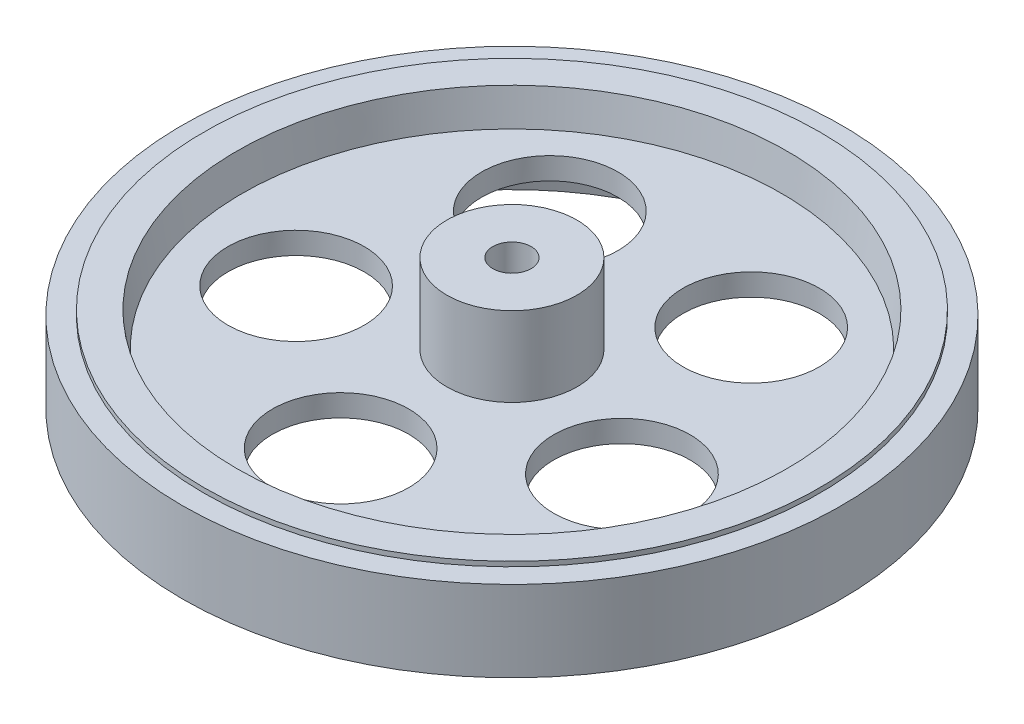
ISO-10303-21;
HEADER;
FILE_DESCRIPTION(('STEP AP214'),'2;1');
FILE_NAME('part.step','',(''),(''),'','','');
FILE_SCHEMA(('AUTOMOTIVE_DESIGN { 1 0 10303 214 1 1 1 1 }'));
ENDSEC;
DATA;
#1=APPLICATION_CONTEXT('core data for automotive mechanical design processes');
#2=APPLICATION_PROTOCOL_DEFINITION('international standard','automotive_design',2000,#1);
#3=PRODUCT_CONTEXT('',#1,'mechanical');
#4=PRODUCT('Part','Part','',(#3));
#5=PRODUCT_RELATED_PRODUCT_CATEGORY('part','',(#4));
#6=PRODUCT_DEFINITION_FORMATION('','',#4);
#7=PRODUCT_DEFINITION_CONTEXT('part definition',#1,'design');
#8=PRODUCT_DEFINITION('design','',#6,#7);
#9=PRODUCT_DEFINITION_SHAPE('','',#8);
#10=(LENGTH_UNIT() NAMED_UNIT(*) SI_UNIT(.MILLI.,.METRE.));
#11=(NAMED_UNIT(*) PLANE_ANGLE_UNIT() SI_UNIT($,.RADIAN.));
#12=(NAMED_UNIT(*) SI_UNIT($,.STERADIAN.) SOLID_ANGLE_UNIT());
#13=UNCERTAINTY_MEASURE_WITH_UNIT(LENGTH_MEASURE(1.E-05),#10,'distance_accuracy_value','');
#14=(GEOMETRIC_REPRESENTATION_CONTEXT(3) GLOBAL_UNCERTAINTY_ASSIGNED_CONTEXT((#13)) GLOBAL_UNIT_ASSIGNED_CONTEXT((#10,
#11,#12)) REPRESENTATION_CONTEXT('',''));
#15=CARTESIAN_POINT('',(0.,0.,0.));
#16=DIRECTION('',(0.,0.,1.));
#17=DIRECTION('',(1.,0.,0.));
#18=AXIS2_PLACEMENT_3D('',#15,#16,#17);
#19=CARTESIAN_POINT('',(0.,-1.6,0.));
#20=DIRECTION('',(0.,-1.,0.));
#21=DIRECTION('',(0.,0.,1.));
#22=AXIS2_PLACEMENT_3D('',#19,#20,#21);
#23=PLANE('',#22);
#24=CARTESIAN_POINT('',(0.,-1.6,0.));
#25=DIRECTION('',(0.,-1.,0.));
#26=DIRECTION('',(0.,0.,-1.));
#27=AXIS2_PLACEMENT_3D('',#24,#25,#26);
#28=CIRCLE('',#27,39.4);
#29=CARTESIAN_POINT('',(0.,-1.6,-39.4));
#30=VERTEX_POINT('',#29);
#31=EDGE_CURVE('E64',#30,#30,#28,.T.);
#32=ORIENTED_EDGE('',*,*,#31,.T.);
#33=EDGE_LOOP('',(#32));
#34=FACE_BOUND('',#33,.T.);
#35=CARTESIAN_POINT('',(0.,-1.6,25.));
#36=DIRECTION('',(0.,-1.,0.));
#37=DIRECTION('',(0.,0.,-1.));
#38=AXIS2_PLACEMENT_3D('',#35,#36,#37);
#39=CIRCLE('',#38,9.95);
#40=CARTESIAN_POINT('',(0.,-1.6,15.05));
#41=VERTEX_POINT('',#40);
#42=EDGE_CURVE('E61',#41,#41,#39,.T.);
#43=ORIENTED_EDGE('',*,*,#42,.F.);
#44=EDGE_LOOP('',(#43));
#45=FACE_BOUND('',#44,.T.);
#46=CARTESIAN_POINT('',(23.7764129073788,-1.6,7.72542485937369));
#47=DIRECTION('',(0.,-1.,0.));
#48=DIRECTION('',(0.,0.,-1.));
#49=AXIS2_PLACEMENT_3D('',#46,#47,#48);
#50=CIRCLE('',#49,9.95);
#51=CARTESIAN_POINT('',(23.7764129073788,-1.6,-2.22457514062631));
#52=VERTEX_POINT('',#51);
#53=EDGE_CURVE('E66',#52,#52,#50,.T.);
#54=ORIENTED_EDGE('',*,*,#53,.F.);
#55=EDGE_LOOP('',(#54));
#56=FACE_BOUND('',#55,.T.);
#57=CARTESIAN_POINT('',(14.6946313073118,-1.6,-20.2254248593737));
#58=DIRECTION('',(0.,-1.,0.));
#59=DIRECTION('',(0.,0.,-1.));
#60=AXIS2_PLACEMENT_3D('',#57,#58,#59);
#61=CIRCLE('',#60,9.95);
#62=CARTESIAN_POINT('',(14.6946313073118,-1.6,-30.1754248593737));
#63=VERTEX_POINT('',#62);
#64=EDGE_CURVE('E69',#63,#63,#61,.T.);
#65=ORIENTED_EDGE('',*,*,#64,.F.);
#66=EDGE_LOOP('',(#65));
#67=FACE_BOUND('',#66,.T.);
#68=CARTESIAN_POINT('',(-14.6946313073118,-1.6,-20.2254248593737));
#69=DIRECTION('',(0.,-1.,0.));
#70=DIRECTION('',(0.,0.,-1.));
#71=AXIS2_PLACEMENT_3D('',#68,#69,#70);
#72=CIRCLE('',#71,9.95);
#73=CARTESIAN_POINT('',(-14.6946313073118,-1.6,-30.1754248593737));
#74=VERTEX_POINT('',#73);
#75=EDGE_CURVE('E72',#74,#74,#72,.T.);
#76=ORIENTED_EDGE('',*,*,#75,.F.);
#77=EDGE_LOOP('',(#76));
#78=FACE_BOUND('',#77,.T.);
#79=CARTESIAN_POINT('',(-23.7764129073788,-1.6,7.72542485937369));
#80=DIRECTION('',(0.,-1.,0.));
#81=DIRECTION('',(0.,0.,-1.));
#82=AXIS2_PLACEMENT_3D('',#79,#80,#81);
#83=CIRCLE('',#82,9.95);
#84=CARTESIAN_POINT('',(-23.7764129073788,-1.6,-2.22457514062631));
#85=VERTEX_POINT('',#84);
#86=EDGE_CURVE('E46',#85,#85,#83,.T.);
#87=ORIENTED_EDGE('',*,*,#86,.F.);
#88=EDGE_LOOP('',(#87));
#89=FACE_BOUND('',#88,.T.);
#90=CARTESIAN_POINT('',(0.,-1.6,0.));
#91=DIRECTION('',(0.,-1.,0.));
#92=DIRECTION('',(0.,0.,-1.));
#93=AXIS2_PLACEMENT_3D('',#90,#91,#92);
#94=CIRCLE('',#93,8.5);
#95=CARTESIAN_POINT('',(0.,-1.6,-8.5));
#96=VERTEX_POINT('',#95);
#97=EDGE_CURVE('E223',#96,#96,#94,.T.);
#98=ORIENTED_EDGE('',*,*,#97,.F.);
#99=EDGE_LOOP('',(#98));
#100=FACE_BOUND('',#99,.T.);
#101=ADVANCED_FACE('F42',(#34,#45,#56,#67,#78,#89,#100),#23,.T.);
#102=CARTESIAN_POINT('',(0.,5.9,0.));
#103=DIRECTION('',(0.,-1.,0.));
#104=DIRECTION('',(0.,0.,-1.));
#105=AXIS2_PLACEMENT_3D('',#102,#103,#104);
#106=CYLINDRICAL_SURFACE('',#105,48.1);
#107=CARTESIAN_POINT('',(0.,5.9,0.));
#108=DIRECTION('',(0.,1.,0.));
#109=DIRECTION('',(0.,0.,1.));
#110=AXIS2_PLACEMENT_3D('',#107,#108,#109);
#111=CIRCLE('',#110,48.1);
#112=CARTESIAN_POINT('',(0.,5.9,48.1));
#113=VERTEX_POINT('',#112);
#114=EDGE_CURVE('E50',#113,#113,#111,.T.);
#115=ORIENTED_EDGE('',*,*,#114,.F.);
#116=EDGE_LOOP('',(#115));
#117=FACE_BOUND('',#116,.T.);
#118=CARTESIAN_POINT('',(0.,-5.9,0.));
#119=DIRECTION('',(0.,1.,0.));
#120=DIRECTION('',(0.,0.,1.));
#121=AXIS2_PLACEMENT_3D('',#118,#119,#120);
#122=CIRCLE('',#121,48.1);
#123=CARTESIAN_POINT('',(0.,-5.9,48.1));
#124=VERTEX_POINT('',#123);
#125=EDGE_CURVE('E95',#124,#124,#122,.T.);
#126=ORIENTED_EDGE('',*,*,#125,.T.);
#127=EDGE_LOOP('',(#126));
#128=FACE_BOUND('',#127,.T.);
#129=ADVANCED_FACE('F44',(#117,#128),#106,.T.);
#130=CARTESIAN_POINT('',(0.,5.9,0.));
#131=DIRECTION('',(0.,1.,0.));
#132=DIRECTION('',(0.,0.,1.));
#133=AXIS2_PLACEMENT_3D('',#130,#131,#132);
#134=PLANE('',#133);
#135=CARTESIAN_POINT('',(0.,5.9,0.));
#136=DIRECTION('',(0.,1.,0.));
#137=DIRECTION('',(0.,0.,1.));
#138=AXIS2_PLACEMENT_3D('',#135,#136,#137);
#139=CIRCLE('',#138,44.95);
#140=CARTESIAN_POINT('',(0.,5.9,44.95));
#141=VERTEX_POINT('',#140);
#142=EDGE_CURVE('E104',#141,#141,#139,.T.);
#143=ORIENTED_EDGE('',*,*,#142,.F.);
#144=EDGE_LOOP('',(#143));
#145=FACE_BOUND('',#144,.T.);
#146=ORIENTED_EDGE('',*,*,#114,.T.);
#147=EDGE_LOOP('',(#146));
#148=FACE_BOUND('',#147,.T.);
#149=ADVANCED_FACE('F121',(#145,#148),#134,.T.);
#150=CARTESIAN_POINT('',(0.,6.6,0.));
#151=DIRECTION('',(0.,-1.,0.));
#152=DIRECTION('',(0.,0.,-1.));
#153=AXIS2_PLACEMENT_3D('',#150,#151,#152);
#154=CYLINDRICAL_SURFACE('',#153,44.95);
#155=CARTESIAN_POINT('',(0.,6.6,0.));
#156=DIRECTION('',(0.,1.,0.));
#157=DIRECTION('',(0.,0.,1.));
#158=AXIS2_PLACEMENT_3D('',#155,#156,#157);
#159=CIRCLE('',#158,44.95);
#160=CARTESIAN_POINT('',(0.,6.6,44.95));
#161=VERTEX_POINT('',#160);
#162=EDGE_CURVE('E55',#161,#161,#159,.T.);
#163=ORIENTED_EDGE('',*,*,#162,.F.);
#164=EDGE_LOOP('',(#163));
#165=FACE_BOUND('',#164,.T.);
#166=ORIENTED_EDGE('',*,*,#142,.T.);
#167=EDGE_LOOP('',(#166));
#168=FACE_BOUND('',#167,.T.);
#169=ADVANCED_FACE('F115',(#165,#168),#154,.T.);
#170=CARTESIAN_POINT('',(0.,6.6,0.));
#171=DIRECTION('',(0.,1.,0.));
#172=DIRECTION('',(0.,0.,1.));
#173=AXIS2_PLACEMENT_3D('',#170,#171,#172);
#174=PLANE('',#173);
#175=CARTESIAN_POINT('',(0.,6.6,0.));
#176=DIRECTION('',(0.,1.,0.));
#177=DIRECTION('',(0.,0.,1.));
#178=AXIS2_PLACEMENT_3D('',#175,#176,#177);
#179=CIRCLE('',#178,40.15);
#180=CARTESIAN_POINT('',(0.,6.6,40.15));
#181=VERTEX_POINT('',#180);
#182=EDGE_CURVE('E101',#181,#181,#179,.T.);
#183=ORIENTED_EDGE('',*,*,#182,.F.);
#184=EDGE_LOOP('',(#183));
#185=FACE_BOUND('',#184,.T.);
#186=ORIENTED_EDGE('',*,*,#162,.T.);
#187=EDGE_LOOP('',(#186));
#188=FACE_BOUND('',#187,.T.);
#189=ADVANCED_FACE('F112',(#185,#188),#174,.T.);
#190=CARTESIAN_POINT('',(0.,1.6,0.));
#191=DIRECTION('',(0.,1.,0.));
#192=DIRECTION('',(0.,0.,1.));
#193=AXIS2_PLACEMENT_3D('',#190,#191,#192);
#194=CONICAL_SURFACE('',#193,39.4,0.148889947609499);
#195=ORIENTED_EDGE('',*,*,#182,.T.);
#196=EDGE_LOOP('',(#195));
#197=FACE_BOUND('',#196,.T.);
#198=CARTESIAN_POINT('',(0.,1.6,0.));
#199=DIRECTION('',(0.,1.,0.));
#200=DIRECTION('',(0.,0.,1.));
#201=AXIS2_PLACEMENT_3D('',#198,#199,#200);
#202=CIRCLE('',#201,39.4);
#203=CARTESIAN_POINT('',(0.,1.6,39.4));
#204=VERTEX_POINT('',#203);
#205=EDGE_CURVE('E98',#204,#204,#202,.T.);
#206=ORIENTED_EDGE('',*,*,#205,.F.);
#207=EDGE_LOOP('',(#206));
#208=FACE_BOUND('',#207,.T.);
#209=ADVANCED_FACE('F109',(#197,#208),#194,.F.);
#210=CARTESIAN_POINT('',(0.,1.6,0.));
#211=DIRECTION('',(0.,1.,0.));
#212=DIRECTION('',(0.,0.,1.));
#213=AXIS2_PLACEMENT_3D('',#210,#211,#212);
#214=PLANE('',#213);
#215=CARTESIAN_POINT('',(0.,1.6,0.));
#216=DIRECTION('',(0.,1.,0.));
#217=DIRECTION('',(0.,0.,1.));
#218=AXIS2_PLACEMENT_3D('',#215,#216,#217);
#219=CIRCLE('',#218,9.5);
#220=CARTESIAN_POINT('',(0.,1.6,9.5));
#221=VERTEX_POINT('',#220);
#222=EDGE_CURVE('E222',#221,#221,#219,.T.);
#223=ORIENTED_EDGE('',*,*,#222,.F.);
#224=EDGE_LOOP('',(#223));
#225=FACE_BOUND('',#224,.T.);
#226=CARTESIAN_POINT('',(-23.7764129073788,1.6,7.72542485937369));
#227=DIRECTION('',(0.,1.,0.));
#228=DIRECTION('',(0.,0.,1.));
#229=AXIS2_PLACEMENT_3D('',#226,#227,#228);
#230=CIRCLE('',#229,9.95);
#231=CARTESIAN_POINT('',(-23.7764129073788,1.6,17.6754248593737));
#232=VERTEX_POINT('',#231);
#233=EDGE_CURVE('E70',#232,#232,#230,.T.);
#234=ORIENTED_EDGE('',*,*,#233,.F.);
#235=EDGE_LOOP('',(#234));
#236=FACE_BOUND('',#235,.T.);
#237=CARTESIAN_POINT('',(-14.6946313073118,1.6,-20.2254248593737));
#238=DIRECTION('',(0.,1.,0.));
#239=DIRECTION('',(0.,0.,1.));
#240=AXIS2_PLACEMENT_3D('',#237,#238,#239);
#241=CIRCLE('',#240,9.95);
#242=CARTESIAN_POINT('',(-14.6946313073118,1.6,-10.2754248593737));
#243=VERTEX_POINT('',#242);
#244=EDGE_CURVE('E233',#243,#243,#241,.T.);
#245=ORIENTED_EDGE('',*,*,#244,.F.);
#246=EDGE_LOOP('',(#245));
#247=FACE_BOUND('',#246,.T.);
#248=CARTESIAN_POINT('',(14.6946313073118,1.6,-20.2254248593737));
#249=DIRECTION('',(0.,1.,0.));
#250=DIRECTION('',(0.,0.,1.));
#251=AXIS2_PLACEMENT_3D('',#248,#249,#250);
#252=CIRCLE('',#251,9.95);
#253=CARTESIAN_POINT('',(14.6946313073118,1.6,-10.2754248593737));
#254=VERTEX_POINT('',#253);
#255=EDGE_CURVE('E235',#254,#254,#252,.T.);
#256=ORIENTED_EDGE('',*,*,#255,.F.);
#257=EDGE_LOOP('',(#256));
#258=FACE_BOUND('',#257,.T.);
#259=CARTESIAN_POINT('',(23.7764129073788,1.6,7.72542485937369));
#260=DIRECTION('',(0.,1.,0.));
#261=DIRECTION('',(0.,0.,1.));
#262=AXIS2_PLACEMENT_3D('',#259,#260,#261);
#263=CIRCLE('',#262,9.95);
#264=CARTESIAN_POINT('',(23.7764129073788,1.6,17.6754248593737));
#265=VERTEX_POINT('',#264);
#266=EDGE_CURVE('E85',#265,#265,#263,.T.);
#267=ORIENTED_EDGE('',*,*,#266,.F.);
#268=EDGE_LOOP('',(#267));
#269=FACE_BOUND('',#268,.T.);
#270=CARTESIAN_POINT('',(0.,1.6,25.));
#271=DIRECTION('',(0.,1.,0.));
#272=DIRECTION('',(0.,0.,1.));
#273=AXIS2_PLACEMENT_3D('',#270,#271,#272);
#274=CIRCLE('',#273,9.95);
#275=CARTESIAN_POINT('',(0.,1.6,34.95));
#276=VERTEX_POINT('',#275);
#277=EDGE_CURVE('E65',#276,#276,#274,.T.);
#278=ORIENTED_EDGE('',*,*,#277,.F.);
#279=EDGE_LOOP('',(#278));
#280=FACE_BOUND('',#279,.T.);
#281=ORIENTED_EDGE('',*,*,#205,.T.);
#282=EDGE_LOOP('',(#281));
#283=FACE_BOUND('',#282,.T.);
#284=ADVANCED_FACE('F136',(#225,#236,#247,#258,#269,#280,#283),#214,.T.);
#285=CARTESIAN_POINT('',(0.,-5.9,0.));
#286=DIRECTION('',(0.,-1.,0.));
#287=DIRECTION('',(0.,0.,1.));
#288=AXIS2_PLACEMENT_3D('',#285,#286,#287);
#289=PLANE('',#288);
#290=CARTESIAN_POINT('',(0.,-5.9,0.));
#291=DIRECTION('',(0.,-1.,0.));
#292=DIRECTION('',(0.,0.,-1.));
#293=AXIS2_PLACEMENT_3D('',#290,#291,#292);
#294=CIRCLE('',#293,44.95);
#295=CARTESIAN_POINT('',(0.,-5.9,-44.95));
#296=VERTEX_POINT('',#295);
#297=EDGE_CURVE('E11',#296,#296,#294,.T.);
#298=ORIENTED_EDGE('',*,*,#297,.F.);
#299=EDGE_LOOP('',(#298));
#300=FACE_BOUND('',#299,.T.);
#301=ORIENTED_EDGE('',*,*,#125,.F.);
#302=EDGE_LOOP('',(#301));
#303=FACE_BOUND('',#302,.T.);
#304=ADVANCED_FACE('F133',(#300,#303),#289,.T.);
#305=CARTESIAN_POINT('',(0.,-6.6,0.));
#306=DIRECTION('',(0.,1.,0.));
#307=DIRECTION('',(0.,0.,1.));
#308=AXIS2_PLACEMENT_3D('',#305,#306,#307);
#309=CYLINDRICAL_SURFACE('',#308,44.95);
#310=CARTESIAN_POINT('',(0.,-6.6,0.));
#311=DIRECTION('',(0.,1.,0.));
#312=DIRECTION('',(0.,0.,1.));
#313=AXIS2_PLACEMENT_3D('',#310,#311,#312);
#314=CIRCLE('',#313,44.95);
#315=CARTESIAN_POINT('',(0.,-6.6,44.95));
#316=VERTEX_POINT('',#315);
#317=EDGE_CURVE('E90',#316,#316,#314,.T.);
#318=ORIENTED_EDGE('',*,*,#317,.T.);
#319=EDGE_LOOP('',(#318));
#320=FACE_BOUND('',#319,.T.);
#321=ORIENTED_EDGE('',*,*,#297,.T.);
#322=EDGE_LOOP('',(#321));
#323=FACE_BOUND('',#322,.T.);
#324=ADVANCED_FACE('F135',(#320,#323),#309,.T.);
#325=CARTESIAN_POINT('',(0.,-6.6,0.));
#326=DIRECTION('',(0.,-1.,0.));
#327=DIRECTION('',(0.,0.,1.));
#328=AXIS2_PLACEMENT_3D('',#325,#326,#327);
#329=PLANE('',#328);
#330=CARTESIAN_POINT('',(0.,-6.6,0.));
#331=DIRECTION('',(0.,-1.,0.));
#332=DIRECTION('',(0.,0.,1.));
#333=AXIS2_PLACEMENT_3D('',#330,#331,#332);
#334=CIRCLE('',#333,40.15);
#335=CARTESIAN_POINT('',(0.,-6.6,40.15));
#336=VERTEX_POINT('',#335);
#337=EDGE_CURVE('E87',#336,#336,#334,.F.);
#338=ORIENTED_EDGE('',*,*,#337,.T.);
#339=EDGE_LOOP('',(#338));
#340=FACE_BOUND('',#339,.T.);
#341=ORIENTED_EDGE('',*,*,#317,.F.);
#342=EDGE_LOOP('',(#341));
#343=FACE_BOUND('',#342,.T.);
#344=ADVANCED_FACE('F143',(#340,#343),#329,.T.);
#345=CARTESIAN_POINT('',(0.,-1.6,0.));
#346=DIRECTION('',(0.,-1.,0.));
#347=DIRECTION('',(0.,0.,-1.));
#348=AXIS2_PLACEMENT_3D('',#345,#346,#347);
#349=CONICAL_SURFACE('',#348,39.4,0.148889947609499);
#350=ORIENTED_EDGE('',*,*,#337,.F.);
#351=EDGE_LOOP('',(#350));
#352=FACE_BOUND('',#351,.T.);
#353=ORIENTED_EDGE('',*,*,#31,.F.);
#354=EDGE_LOOP('',(#353));
#355=FACE_BOUND('',#354,.T.);
#356=ADVANCED_FACE('F157',(#352,#355),#349,.F.);
#357=CARTESIAN_POINT('',(0.,-6.6,25.));
#358=DIRECTION('',(0.,1.,0.));
#359=DIRECTION('',(0.,0.,1.));
#360=AXIS2_PLACEMENT_3D('',#357,#358,#359);
#361=CYLINDRICAL_SURFACE('',#360,9.95);
#362=ORIENTED_EDGE('',*,*,#42,.T.);
#363=EDGE_LOOP('',(#362));
#364=FACE_BOUND('',#363,.T.);
#365=ORIENTED_EDGE('',*,*,#277,.T.);
#366=EDGE_LOOP('',(#365));
#367=FACE_BOUND('',#366,.T.);
#368=ADVANCED_FACE('F164',(#364,#367),#361,.F.);
#369=CARTESIAN_POINT('',(23.7764129073788,-6.6,7.72542485937369));
#370=DIRECTION('',(0.,1.,0.));
#371=DIRECTION('',(0.,0.,1.));
#372=AXIS2_PLACEMENT_3D('',#369,#370,#371);
#373=CYLINDRICAL_SURFACE('',#372,9.95);
#374=ORIENTED_EDGE('',*,*,#53,.T.);
#375=EDGE_LOOP('',(#374));
#376=FACE_BOUND('',#375,.T.);
#377=ORIENTED_EDGE('',*,*,#266,.T.);
#378=EDGE_LOOP('',(#377));
#379=FACE_BOUND('',#378,.T.);
#380=ADVANCED_FACE('F174',(#376,#379),#373,.F.);
#381=CARTESIAN_POINT('',(14.6946313073118,-6.6,-20.2254248593737));
#382=DIRECTION('',(0.,1.,0.));
#383=DIRECTION('',(0.,0.,1.));
#384=AXIS2_PLACEMENT_3D('',#381,#382,#383);
#385=CYLINDRICAL_SURFACE('',#384,9.95);
#386=ORIENTED_EDGE('',*,*,#64,.T.);
#387=EDGE_LOOP('',(#386));
#388=FACE_BOUND('',#387,.T.);
#389=ORIENTED_EDGE('',*,*,#255,.T.);
#390=EDGE_LOOP('',(#389));
#391=FACE_BOUND('',#390,.T.);
#392=ADVANCED_FACE('F179',(#388,#391),#385,.F.);
#393=CARTESIAN_POINT('',(-14.6946313073118,-6.6,-20.2254248593737));
#394=DIRECTION('',(0.,1.,0.));
#395=DIRECTION('',(0.,0.,1.));
#396=AXIS2_PLACEMENT_3D('',#393,#394,#395);
#397=CYLINDRICAL_SURFACE('',#396,9.95);
#398=ORIENTED_EDGE('',*,*,#75,.T.);
#399=EDGE_LOOP('',(#398));
#400=FACE_BOUND('',#399,.T.);
#401=ORIENTED_EDGE('',*,*,#244,.T.);
#402=EDGE_LOOP('',(#401));
#403=FACE_BOUND('',#402,.T.);
#404=ADVANCED_FACE('F185',(#400,#403),#397,.F.);
#405=CARTESIAN_POINT('',(-23.7764129073788,-6.6,7.72542485937369));
#406=DIRECTION('',(0.,1.,0.));
#407=DIRECTION('',(0.,0.,1.));
#408=AXIS2_PLACEMENT_3D('',#405,#406,#407);
#409=CYLINDRICAL_SURFACE('',#408,9.95);
#410=ORIENTED_EDGE('',*,*,#86,.T.);
#411=EDGE_LOOP('',(#410));
#412=FACE_BOUND('',#411,.T.);
#413=ORIENTED_EDGE('',*,*,#233,.T.);
#414=EDGE_LOOP('',(#413));
#415=FACE_BOUND('',#414,.T.);
#416=ADVANCED_FACE('F189',(#412,#415),#409,.F.);
#417=CARTESIAN_POINT('',(0.,13.2,0.));
#418=DIRECTION('',(0.,-1.,0.));
#419=DIRECTION('',(0.,0.,-1.));
#420=AXIS2_PLACEMENT_3D('',#417,#418,#419);
#421=CYLINDRICAL_SURFACE('',#420,9.5);
#422=CARTESIAN_POINT('',(0.,13.2,0.));
#423=DIRECTION('',(0.,1.,0.));
#424=DIRECTION('',(0.,0.,1.));
#425=AXIS2_PLACEMENT_3D('',#422,#423,#424);
#426=CIRCLE('',#425,9.5);
#427=CARTESIAN_POINT('',(0.,13.2,9.5));
#428=VERTEX_POINT('',#427);
#429=EDGE_CURVE('E226',#428,#428,#426,.T.);
#430=ORIENTED_EDGE('',*,*,#429,.F.);
#431=EDGE_LOOP('',(#430));
#432=FACE_BOUND('',#431,.T.);
#433=ORIENTED_EDGE('',*,*,#222,.T.);
#434=EDGE_LOOP('',(#433));
#435=FACE_BOUND('',#434,.T.);
#436=ADVANCED_FACE('F192',(#432,#435),#421,.T.);
#437=CARTESIAN_POINT('',(0.,13.2,0.));
#438=DIRECTION('',(0.,1.,0.));
#439=DIRECTION('',(0.,0.,1.));
#440=AXIS2_PLACEMENT_3D('',#437,#438,#439);
#441=PLANE('',#440);
#442=CARTESIAN_POINT('',(0.,13.2,0.));
#443=DIRECTION('',(0.,1.,0.));
#444=DIRECTION('',(0.,0.,1.));
#445=AXIS2_PLACEMENT_3D('',#442,#443,#444);
#446=CIRCLE('',#445,2.8);
#447=CARTESIAN_POINT('',(0.,13.2,2.8));
#448=VERTEX_POINT('',#447);
#449=EDGE_CURVE('E429',#448,#448,#446,.T.);
#450=ORIENTED_EDGE('',*,*,#449,.F.);
#451=EDGE_LOOP('',(#450));
#452=FACE_BOUND('',#451,.T.);
#453=ORIENTED_EDGE('',*,*,#429,.T.);
#454=EDGE_LOOP('',(#453));
#455=FACE_BOUND('',#454,.T.);
#456=ADVANCED_FACE('F195',(#452,#455),#441,.T.);
#457=CARTESIAN_POINT('',(0.,-6.,0.));
#458=DIRECTION('',(0.,-1.,0.));
#459=DIRECTION('',(0.,0.,-1.));
#460=AXIS2_PLACEMENT_3D('',#457,#458,#459);
#461=PLANE('',#460);
#462=CARTESIAN_POINT('',(0.,-6.,0.));
#463=DIRECTION('',(0.,-1.,0.));
#464=DIRECTION('',(0.,0.,-1.));
#465=AXIS2_PLACEMENT_3D('',#462,#463,#464);
#466=CIRCLE('',#465,2.8);
#467=CARTESIAN_POINT('',(0.,-6.,-2.8));
#468=VERTEX_POINT('',#467);
#469=EDGE_CURVE('E420',#468,#468,#466,.F.);
#470=ORIENTED_EDGE('',*,*,#469,.T.);
#471=EDGE_LOOP('',(#470));
#472=FACE_BOUND('',#471,.T.);
#473=CARTESIAN_POINT('',(0.,-6.,0.));
#474=DIRECTION('',(0.,-1.,0.));
#475=DIRECTION('',(0.,0.,-1.));
#476=AXIS2_PLACEMENT_3D('',#473,#474,#475);
#477=CIRCLE('',#476,7.95);
#478=CARTESIAN_POINT('',(0.,-6.,-7.95));
#479=VERTEX_POINT('',#478);
#480=EDGE_CURVE('E215',#479,#479,#477,.T.);
#481=ORIENTED_EDGE('',*,*,#480,.T.);
#482=EDGE_LOOP('',(#481));
#483=FACE_BOUND('',#482,.T.);
#484=ADVANCED_FACE('F199',(#472,#483),#461,.T.);
#485=CARTESIAN_POINT('',(0.,-6.,0.));
#486=DIRECTION('',(0.,1.,0.));
#487=DIRECTION('',(0.,0.,1.));
#488=AXIS2_PLACEMENT_3D('',#485,#486,#487);
#489=CONICAL_SURFACE('',#488,7.95,0.124354994546761);
#490=ORIENTED_EDGE('',*,*,#97,.T.);
#491=EDGE_LOOP('',(#490));
#492=FACE_BOUND('',#491,.T.);
#493=ORIENTED_EDGE('',*,*,#480,.F.);
#494=EDGE_LOOP('',(#493));
#495=FACE_BOUND('',#494,.T.);
#496=ADVANCED_FACE('F204',(#492,#495),#489,.T.);
#497=CARTESIAN_POINT('',(0.,-6.601,0.));
#498=DIRECTION('',(0.,1.,0.));
#499=DIRECTION('',(0.,0.,1.));
#500=AXIS2_PLACEMENT_3D('',#497,#498,#499);
#501=CYLINDRICAL_SURFACE('',#500,2.8);
#502=ORIENTED_EDGE('',*,*,#469,.F.);
#503=EDGE_LOOP('',(#502));
#504=FACE_BOUND('',#503,.T.);
#505=ORIENTED_EDGE('',*,*,#449,.T.);
#506=EDGE_LOOP('',(#505));
#507=FACE_BOUND('',#506,.T.);
#508=ADVANCED_FACE('F273',(#504,#507),#501,.F.);
#509=CLOSED_SHELL('',(#101,#129,#149,#169,#189,#209,#284,#304,#324,#344,#356,#368,#380,#392,
#404,#416,#436,#456,#484,#496,#508));
#510=MANIFOLD_SOLID_BREP('B2',#509);
#511=ADVANCED_BREP_SHAPE_REPRESENTATION('',(#18,#510),#14);
#512=SHAPE_DEFINITION_REPRESENTATION(#9,#511);
ENDSEC;
END-ISO-10303-21;
